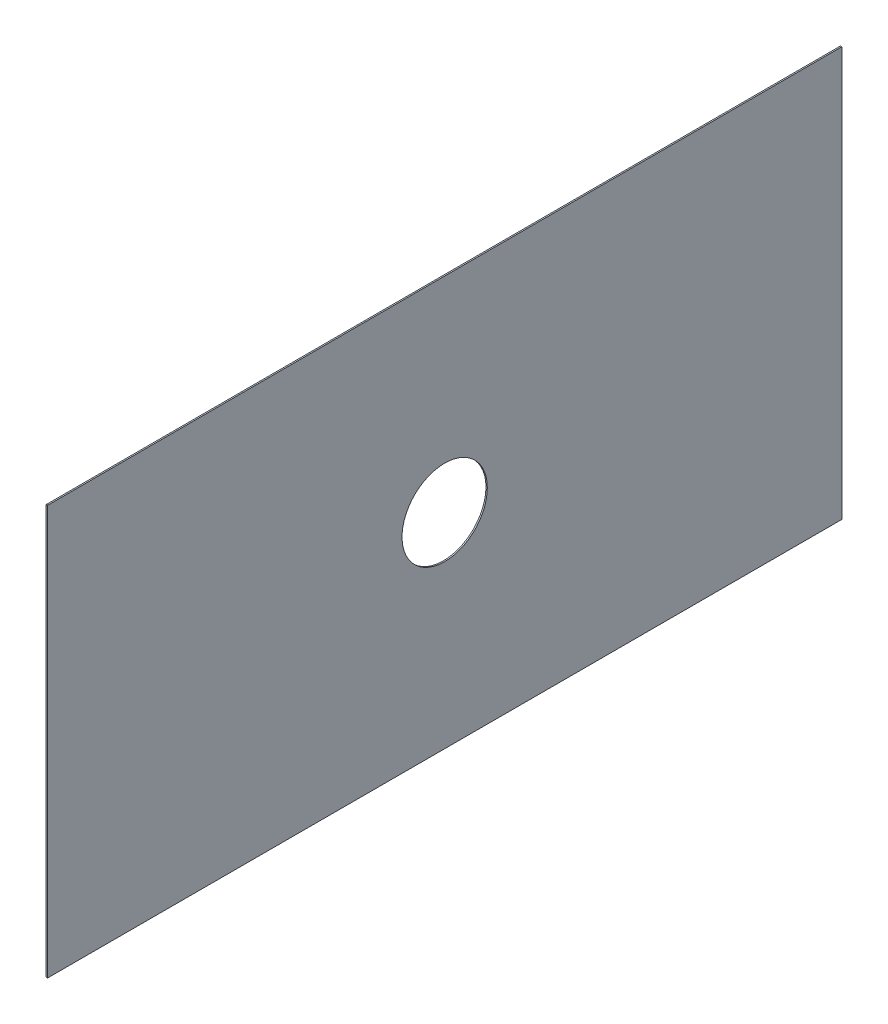
ISO-10303-21;
HEADER;
FILE_DESCRIPTION(('STEP AP214'),'2;1');
FILE_NAME('part.step','',(''),(''),'','','');
FILE_SCHEMA(('AUTOMOTIVE_DESIGN { 1 0 10303 214 1 1 1 1 }'));
ENDSEC;
DATA;
#1=APPLICATION_CONTEXT('core data for automotive mechanical design processes');
#2=APPLICATION_PROTOCOL_DEFINITION('international standard','automotive_design',2000,#1);
#3=PRODUCT_CONTEXT('',#1,'mechanical');
#4=PRODUCT('Part','Part','',(#3));
#5=PRODUCT_RELATED_PRODUCT_CATEGORY('part','',(#4));
#6=PRODUCT_DEFINITION_FORMATION('','',#4);
#7=PRODUCT_DEFINITION_CONTEXT('part definition',#1,'design');
#8=PRODUCT_DEFINITION('design','',#6,#7);
#9=PRODUCT_DEFINITION_SHAPE('','',#8);
#10=(LENGTH_UNIT() NAMED_UNIT(*) SI_UNIT(.MILLI.,.METRE.));
#11=(NAMED_UNIT(*) PLANE_ANGLE_UNIT() SI_UNIT($,.RADIAN.));
#12=(NAMED_UNIT(*) SI_UNIT($,.STERADIAN.) SOLID_ANGLE_UNIT());
#13=UNCERTAINTY_MEASURE_WITH_UNIT(LENGTH_MEASURE(1.E-05),#10,'distance_accuracy_value','');
#14=(GEOMETRIC_REPRESENTATION_CONTEXT(3) GLOBAL_UNCERTAINTY_ASSIGNED_CONTEXT((#13)) GLOBAL_UNIT_ASSIGNED_CONTEXT((#10,
#11,#12)) REPRESENTATION_CONTEXT('',''));
#15=CARTESIAN_POINT('',(0.,0.,0.));
#16=DIRECTION('',(0.,0.,1.));
#17=DIRECTION('',(1.,0.,0.));
#18=AXIS2_PLACEMENT_3D('',#15,#16,#17);
#19=CARTESIAN_POINT('',(2.,-300.,582.));
#20=DIRECTION('',(0.,0.,-1.));
#21=DIRECTION('',(-1.,0.,0.));
#22=AXIS2_PLACEMENT_3D('',#19,#20,#21);
#23=PLANE('',#22);
#24=DIRECTION('',(0.,-1.,0.));
#25=VECTOR('',#24,1.);
#26=CARTESIAN_POINT('',(0.,-300.,582.));
#27=LINE('',#26,#25);
#28=CARTESIAN_POINT('',(0.,300.,582.));
#29=VERTEX_POINT('',#28);
#30=CARTESIAN_POINT('',(0.,-300.,582.));
#31=VERTEX_POINT('',#30);
#32=EDGE_CURVE('E93',#29,#31,#27,.T.);
#33=ORIENTED_EDGE('',*,*,#32,.T.);
#34=DIRECTION('',(-1.,0.,0.));
#35=VECTOR('',#34,1.);
#36=CARTESIAN_POINT('',(2.,-300.,582.));
#37=LINE('',#36,#35);
#38=CARTESIAN_POINT('',(2.,-300.,582.));
#39=VERTEX_POINT('',#38);
#40=EDGE_CURVE('E11',#39,#31,#37,.T.);
#41=ORIENTED_EDGE('',*,*,#40,.F.);
#42=DIRECTION('',(0.,-1.,0.));
#43=VECTOR('',#42,1.);
#44=CARTESIAN_POINT('',(2.,-300.,582.));
#45=LINE('',#44,#43);
#46=CARTESIAN_POINT('',(2.,300.,582.));
#47=VERTEX_POINT('',#46);
#48=EDGE_CURVE('E81',#47,#39,#45,.T.);
#49=ORIENTED_EDGE('',*,*,#48,.F.);
#50=DIRECTION('',(-1.,0.,0.));
#51=VECTOR('',#50,1.);
#52=CARTESIAN_POINT('',(2.,300.,582.));
#53=LINE('',#52,#51);
#54=EDGE_CURVE('E89',#47,#29,#53,.T.);
#55=ORIENTED_EDGE('',*,*,#54,.T.);
#56=EDGE_LOOP('',(#33,#41,#49,#55));
#57=FACE_BOUND('',#56,.T.);
#58=ADVANCED_FACE('F30',(#57),#23,.F.);
#59=CARTESIAN_POINT('',(2.,-300.,-582.));
#60=DIRECTION('',(0.,1.,0.));
#61=DIRECTION('',(0.,0.,1.));
#62=AXIS2_PLACEMENT_3D('',#59,#60,#61);
#63=PLANE('',#62);
#64=DIRECTION('',(0.,0.,-1.));
#65=VECTOR('',#64,1.);
#66=CARTESIAN_POINT('',(0.,-300.,-582.));
#67=LINE('',#66,#65);
#68=CARTESIAN_POINT('',(0.,-300.,-582.));
#69=VERTEX_POINT('',#68);
#70=EDGE_CURVE('E85',#31,#69,#67,.T.);
#71=ORIENTED_EDGE('',*,*,#70,.T.);
#72=DIRECTION('',(-1.,0.,0.));
#73=VECTOR('',#72,1.);
#74=CARTESIAN_POINT('',(2.,-300.,-582.));
#75=LINE('',#74,#73);
#76=CARTESIAN_POINT('',(2.,-300.,-582.));
#77=VERTEX_POINT('',#76);
#78=EDGE_CURVE('E38',#77,#69,#75,.T.);
#79=ORIENTED_EDGE('',*,*,#78,.F.);
#80=DIRECTION('',(0.,0.,-1.));
#81=VECTOR('',#80,1.);
#82=CARTESIAN_POINT('',(2.,-300.,-582.));
#83=LINE('',#82,#81);
#84=EDGE_CURVE('E76',#39,#77,#83,.T.);
#85=ORIENTED_EDGE('',*,*,#84,.F.);
#86=ORIENTED_EDGE('',*,*,#40,.T.);
#87=EDGE_LOOP('',(#71,#79,#85,#86));
#88=FACE_BOUND('',#87,.T.);
#89=ADVANCED_FACE('F84',(#88),#63,.F.);
#90=CARTESIAN_POINT('',(2.,-300.,-582.));
#91=DIRECTION('',(0.,0.,1.));
#92=DIRECTION('',(1.,0.,0.));
#93=AXIS2_PLACEMENT_3D('',#90,#91,#92);
#94=PLANE('',#93);
#95=DIRECTION('',(0.,1.,0.));
#96=VECTOR('',#95,1.);
#97=CARTESIAN_POINT('',(0.,-300.,-582.));
#98=LINE('',#97,#96);
#99=CARTESIAN_POINT('',(0.,300.,-582.));
#100=VERTEX_POINT('',#99);
#101=EDGE_CURVE('E63',#69,#100,#98,.T.);
#102=ORIENTED_EDGE('',*,*,#101,.T.);
#103=DIRECTION('',(-1.,0.,0.));
#104=VECTOR('',#103,1.);
#105=CARTESIAN_POINT('',(2.,300.,-582.));
#106=LINE('',#105,#104);
#107=CARTESIAN_POINT('',(2.,300.,-582.));
#108=VERTEX_POINT('',#107);
#109=EDGE_CURVE('E86',#108,#100,#106,.T.);
#110=ORIENTED_EDGE('',*,*,#109,.F.);
#111=DIRECTION('',(0.,1.,0.));
#112=VECTOR('',#111,1.);
#113=CARTESIAN_POINT('',(2.,-300.,-582.));
#114=LINE('',#113,#112);
#115=EDGE_CURVE('E79',#77,#108,#114,.T.);
#116=ORIENTED_EDGE('',*,*,#115,.F.);
#117=ORIENTED_EDGE('',*,*,#78,.T.);
#118=EDGE_LOOP('',(#102,#110,#116,#117));
#119=FACE_BOUND('',#118,.T.);
#120=ADVANCED_FACE('F87',(#119),#94,.F.);
#121=CARTESIAN_POINT('',(2.,300.,-582.));
#122=DIRECTION('',(0.,-1.,0.));
#123=DIRECTION('',(0.,0.,-1.));
#124=AXIS2_PLACEMENT_3D('',#121,#122,#123);
#125=PLANE('',#124);
#126=DIRECTION('',(0.,0.,1.));
#127=VECTOR('',#126,1.);
#128=CARTESIAN_POINT('',(0.,300.,-582.));
#129=LINE('',#128,#127);
#130=EDGE_CURVE('E69',#100,#29,#129,.T.);
#131=ORIENTED_EDGE('',*,*,#130,.T.);
#132=ORIENTED_EDGE('',*,*,#54,.F.);
#133=DIRECTION('',(0.,0.,1.));
#134=VECTOR('',#133,1.);
#135=CARTESIAN_POINT('',(2.,300.,-582.));
#136=LINE('',#135,#134);
#137=EDGE_CURVE('E46',#108,#47,#136,.T.);
#138=ORIENTED_EDGE('',*,*,#137,.F.);
#139=ORIENTED_EDGE('',*,*,#109,.T.);
#140=EDGE_LOOP('',(#131,#132,#138,#139));
#141=FACE_BOUND('',#140,.T.);
#142=ADVANCED_FACE('F101',(#141),#125,.F.);
#143=CARTESIAN_POINT('',(2.,300.,582.));
#144=DIRECTION('',(1.,0.,0.));
#145=DIRECTION('',(0.,0.,-1.));
#146=AXIS2_PLACEMENT_3D('',#143,#144,#145);
#147=PLANE('',#146);
#148=CARTESIAN_POINT('',(2.,0.,0.));
#149=DIRECTION('',(1.,0.,0.));
#150=DIRECTION('',(0.,0.,-1.));
#151=AXIS2_PLACEMENT_3D('',#148,#149,#150);
#152=CIRCLE('',#151,62.5);
#153=CARTESIAN_POINT('',(2.,0.,-62.5));
#154=VERTEX_POINT('',#153);
#155=EDGE_CURVE('E107',#154,#154,#152,.T.);
#156=ORIENTED_EDGE('',*,*,#155,.F.);
#157=EDGE_LOOP('',(#156));
#158=FACE_BOUND('',#157,.T.);
#159=ORIENTED_EDGE('',*,*,#48,.T.);
#160=ORIENTED_EDGE('',*,*,#84,.T.);
#161=ORIENTED_EDGE('',*,*,#115,.T.);
#162=ORIENTED_EDGE('',*,*,#137,.T.);
#163=EDGE_LOOP('',(#159,#160,#161,#162));
#164=FACE_BOUND('',#163,.T.);
#165=ADVANCED_FACE('F77',(#158,#164),#147,.T.);
#166=CARTESIAN_POINT('',(0.,300.,582.));
#167=DIRECTION('',(1.,0.,0.));
#168=DIRECTION('',(0.,0.,-1.));
#169=AXIS2_PLACEMENT_3D('',#166,#167,#168);
#170=PLANE('',#169);
#171=CARTESIAN_POINT('',(0.,0.,0.));
#172=DIRECTION('',(1.,0.,0.));
#173=DIRECTION('',(0.,0.,-1.));
#174=AXIS2_PLACEMENT_3D('',#171,#172,#173);
#175=CIRCLE('',#174,62.5);
#176=CARTESIAN_POINT('',(0.,0.,-62.5));
#177=VERTEX_POINT('',#176);
#178=EDGE_CURVE('E96',#177,#177,#175,.T.);
#179=ORIENTED_EDGE('',*,*,#178,.T.);
#180=EDGE_LOOP('',(#179));
#181=FACE_BOUND('',#180,.T.);
#182=ORIENTED_EDGE('',*,*,#32,.F.);
#183=ORIENTED_EDGE('',*,*,#130,.F.);
#184=ORIENTED_EDGE('',*,*,#101,.F.);
#185=ORIENTED_EDGE('',*,*,#70,.F.);
#186=EDGE_LOOP('',(#182,#183,#184,#185));
#187=FACE_BOUND('',#186,.T.);
#188=ADVANCED_FACE('F104',(#181,#187),#170,.F.);
#189=CARTESIAN_POINT('',(0.,0.,0.));
#190=DIRECTION('',(1.,0.,0.));
#191=DIRECTION('',(0.,0.,-1.));
#192=AXIS2_PLACEMENT_3D('',#189,#190,#191);
#193=CYLINDRICAL_SURFACE('',#192,62.5);
#194=ORIENTED_EDGE('',*,*,#178,.F.);
#195=EDGE_LOOP('',(#194));
#196=FACE_BOUND('',#195,.T.);
#197=ORIENTED_EDGE('',*,*,#155,.T.);
#198=EDGE_LOOP('',(#197));
#199=FACE_BOUND('',#198,.T.);
#200=ADVANCED_FACE('F114',(#196,#199),#193,.F.);
#201=CLOSED_SHELL('',(#58,#89,#120,#142,#165,#188,#200));
#202=MANIFOLD_SOLID_BREP('B2',#201);
#203=ADVANCED_BREP_SHAPE_REPRESENTATION('',(#18,#202),#14);
#204=SHAPE_DEFINITION_REPRESENTATION(#9,#203);
ENDSEC;
END-ISO-10303-21;
